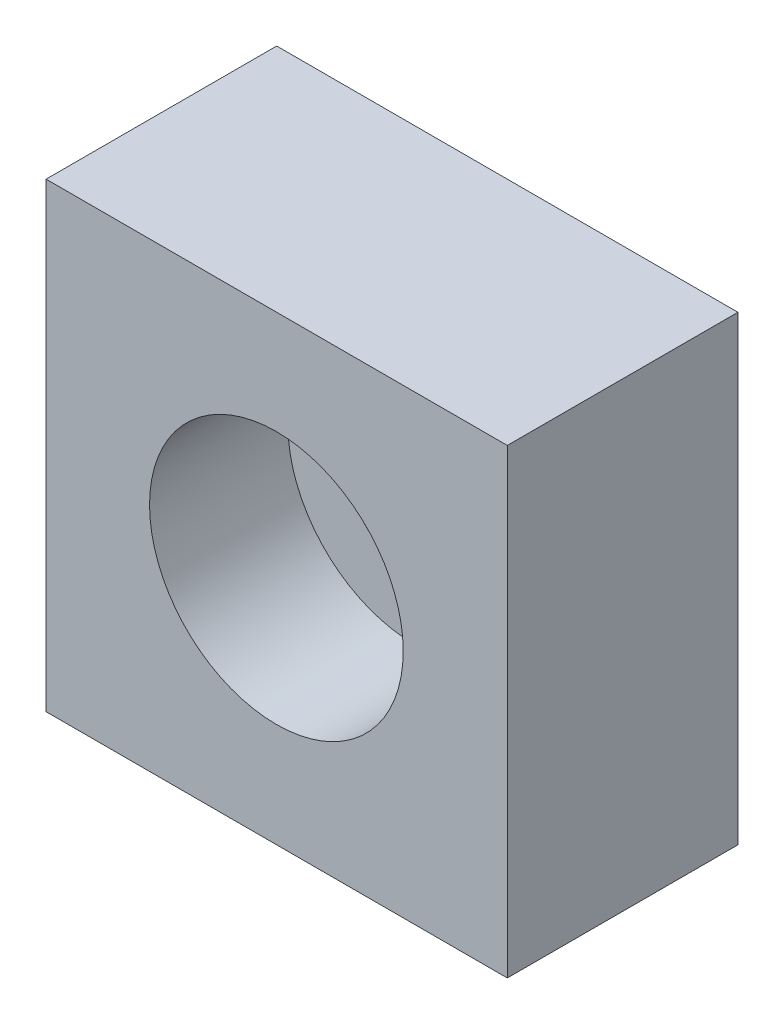
ISO-10303-21;
HEADER;
FILE_DESCRIPTION(('STEP AP214'),'2;1');
FILE_NAME('part.step','',(''),(''),'','','');
FILE_SCHEMA(('AUTOMOTIVE_DESIGN { 1 0 10303 214 1 1 1 1 }'));
ENDSEC;
DATA;
#1=APPLICATION_CONTEXT('core data for automotive mechanical design processes');
#2=APPLICATION_PROTOCOL_DEFINITION('international standard','automotive_design',2000,#1);
#3=PRODUCT_CONTEXT('',#1,'mechanical');
#4=PRODUCT('Part','Part','',(#3));
#5=PRODUCT_RELATED_PRODUCT_CATEGORY('part','',(#4));
#6=PRODUCT_DEFINITION_FORMATION('','',#4);
#7=PRODUCT_DEFINITION_CONTEXT('part definition',#1,'design');
#8=PRODUCT_DEFINITION('design','',#6,#7);
#9=PRODUCT_DEFINITION_SHAPE('','',#8);
#10=(LENGTH_UNIT() NAMED_UNIT(*) SI_UNIT(.MILLI.,.METRE.));
#11=(NAMED_UNIT(*) PLANE_ANGLE_UNIT() SI_UNIT($,.RADIAN.));
#12=(NAMED_UNIT(*) SI_UNIT($,.STERADIAN.) SOLID_ANGLE_UNIT());
#13=UNCERTAINTY_MEASURE_WITH_UNIT(LENGTH_MEASURE(1.E-05),#10,'distance_accuracy_value','');
#14=(GEOMETRIC_REPRESENTATION_CONTEXT(3) GLOBAL_UNCERTAINTY_ASSIGNED_CONTEXT((#13)) GLOBAL_UNIT_ASSIGNED_CONTEXT((#10,
#11,#12)) REPRESENTATION_CONTEXT('',''));
#15=CARTESIAN_POINT('',(0.,0.,0.));
#16=DIRECTION('',(0.,0.,1.));
#17=DIRECTION('',(1.,0.,0.));
#18=AXIS2_PLACEMENT_3D('',#15,#16,#17);
#19=CARTESIAN_POINT('',(0.,0.,10.));
#20=DIRECTION('',(1.,0.,0.));
#21=DIRECTION('',(0.,0.,-1.));
#22=AXIS2_PLACEMENT_3D('',#19,#20,#21);
#23=PLANE('',#22);
#24=DIRECTION('',(0.,-1.,0.));
#25=VECTOR('',#24,1.);
#26=CARTESIAN_POINT('',(0.,0.,0.));
#27=LINE('',#26,#25);
#28=CARTESIAN_POINT('',(0.,20.,0.));
#29=VERTEX_POINT('',#28);
#30=CARTESIAN_POINT('',(0.,0.,0.));
#31=VERTEX_POINT('',#30);
#32=EDGE_CURVE('E105',#29,#31,#27,.T.);
#33=ORIENTED_EDGE('',*,*,#32,.T.);
#34=DIRECTION('',(0.,0.,-1.));
#35=VECTOR('',#34,1.);
#36=CARTESIAN_POINT('',(0.,0.,10.));
#37=LINE('',#36,#35);
#38=CARTESIAN_POINT('',(0.,0.,10.));
#39=VERTEX_POINT('',#38);
#40=EDGE_CURVE('E11',#39,#31,#37,.T.);
#41=ORIENTED_EDGE('',*,*,#40,.F.);
#42=DIRECTION('',(0.,-1.,0.));
#43=VECTOR('',#42,1.);
#44=CARTESIAN_POINT('',(0.,0.,10.));
#45=LINE('',#44,#43);
#46=CARTESIAN_POINT('',(0.,20.,10.));
#47=VERTEX_POINT('',#46);
#48=EDGE_CURVE('E89',#47,#39,#45,.T.);
#49=ORIENTED_EDGE('',*,*,#48,.F.);
#50=DIRECTION('',(0.,0.,-1.));
#51=VECTOR('',#50,1.);
#52=CARTESIAN_POINT('',(0.,20.,10.));
#53=LINE('',#52,#51);
#54=EDGE_CURVE('E98',#47,#29,#53,.T.);
#55=ORIENTED_EDGE('',*,*,#54,.T.);
#56=EDGE_LOOP('',(#33,#41,#49,#55));
#57=FACE_BOUND('',#56,.T.);
#58=ADVANCED_FACE('F39',(#57),#23,.F.);
#59=CARTESIAN_POINT('',(0.,0.,10.));
#60=DIRECTION('',(0.,1.,0.));
#61=DIRECTION('',(0.,0.,1.));
#62=AXIS2_PLACEMENT_3D('',#59,#60,#61);
#63=PLANE('',#62);
#64=DIRECTION('',(1.,0.,0.));
#65=VECTOR('',#64,1.);
#66=CARTESIAN_POINT('',(0.,0.,0.));
#67=LINE('',#66,#65);
#68=CARTESIAN_POINT('',(20.,0.,0.));
#69=VERTEX_POINT('',#68);
#70=EDGE_CURVE('E94',#31,#69,#67,.T.);
#71=ORIENTED_EDGE('',*,*,#70,.T.);
#72=DIRECTION('',(0.,0.,-1.));
#73=VECTOR('',#72,1.);
#74=CARTESIAN_POINT('',(20.,0.,10.));
#75=LINE('',#74,#73);
#76=CARTESIAN_POINT('',(20.,0.,10.));
#77=VERTEX_POINT('',#76);
#78=EDGE_CURVE('E50',#77,#69,#75,.T.);
#79=ORIENTED_EDGE('',*,*,#78,.F.);
#80=DIRECTION('',(1.,0.,0.));
#81=VECTOR('',#80,1.);
#82=CARTESIAN_POINT('',(0.,0.,10.));
#83=LINE('',#82,#81);
#84=EDGE_CURVE('E84',#39,#77,#83,.T.);
#85=ORIENTED_EDGE('',*,*,#84,.F.);
#86=ORIENTED_EDGE('',*,*,#40,.T.);
#87=EDGE_LOOP('',(#71,#79,#85,#86));
#88=FACE_BOUND('',#87,.T.);
#89=ADVANCED_FACE('F91',(#88),#63,.F.);
#90=CARTESIAN_POINT('',(20.,0.,10.));
#91=DIRECTION('',(-1.,0.,0.));
#92=DIRECTION('',(0.,0.,1.));
#93=AXIS2_PLACEMENT_3D('',#90,#91,#92);
#94=PLANE('',#93);
#95=DIRECTION('',(0.,1.,0.));
#96=VECTOR('',#95,1.);
#97=CARTESIAN_POINT('',(20.,0.,0.));
#98=LINE('',#97,#96);
#99=CARTESIAN_POINT('',(20.,20.,0.));
#100=VERTEX_POINT('',#99);
#101=EDGE_CURVE('E75',#69,#100,#98,.T.);
#102=ORIENTED_EDGE('',*,*,#101,.T.);
#103=DIRECTION('',(0.,0.,-1.));
#104=VECTOR('',#103,1.);
#105=CARTESIAN_POINT('',(20.,20.,10.));
#106=LINE('',#105,#104);
#107=CARTESIAN_POINT('',(20.,20.,10.));
#108=VERTEX_POINT('',#107);
#109=EDGE_CURVE('E92',#108,#100,#106,.T.);
#110=ORIENTED_EDGE('',*,*,#109,.F.);
#111=DIRECTION('',(0.,1.,0.));
#112=VECTOR('',#111,1.);
#113=CARTESIAN_POINT('',(20.,0.,10.));
#114=LINE('',#113,#112);
#115=EDGE_CURVE('E86',#77,#108,#114,.T.);
#116=ORIENTED_EDGE('',*,*,#115,.F.);
#117=ORIENTED_EDGE('',*,*,#78,.T.);
#118=EDGE_LOOP('',(#102,#110,#116,#117));
#119=FACE_BOUND('',#118,.T.);
#120=ADVANCED_FACE('F96',(#119),#94,.F.);
#121=CARTESIAN_POINT('',(0.,20.,10.));
#122=DIRECTION('',(0.,-1.,0.));
#123=DIRECTION('',(0.,0.,-1.));
#124=AXIS2_PLACEMENT_3D('',#121,#122,#123);
#125=PLANE('',#124);
#126=DIRECTION('',(-1.,0.,0.));
#127=VECTOR('',#126,1.);
#128=CARTESIAN_POINT('',(0.,20.,0.));
#129=LINE('',#128,#127);
#130=EDGE_CURVE('E79',#100,#29,#129,.T.);
#131=ORIENTED_EDGE('',*,*,#130,.T.);
#132=ORIENTED_EDGE('',*,*,#54,.F.);
#133=DIRECTION('',(-1.,0.,0.));
#134=VECTOR('',#133,1.);
#135=CARTESIAN_POINT('',(0.,20.,10.));
#136=LINE('',#135,#134);
#137=EDGE_CURVE('E54',#108,#47,#136,.T.);
#138=ORIENTED_EDGE('',*,*,#137,.F.);
#139=ORIENTED_EDGE('',*,*,#109,.T.);
#140=EDGE_LOOP('',(#131,#132,#138,#139));
#141=FACE_BOUND('',#140,.T.);
#142=ADVANCED_FACE('F109',(#141),#125,.F.);
#143=CARTESIAN_POINT('',(0.,0.,10.));
#144=DIRECTION('',(0.,0.,-1.));
#145=DIRECTION('',(-1.,0.,0.));
#146=AXIS2_PLACEMENT_3D('',#143,#144,#145);
#147=PLANE('',#146);
#148=CARTESIAN_POINT('',(9.98648737498797,10.0143055988724,10.));
#149=DIRECTION('',(0.,0.,1.));
#150=DIRECTION('',(1.,0.,0.));
#151=AXIS2_PLACEMENT_3D('',#148,#149,#150);
#152=CIRCLE('',#151,5.49999999999999);
#153=CARTESIAN_POINT('',(15.486487374988,10.0143055988724,10.));
#154=VERTEX_POINT('',#153);
#155=EDGE_CURVE('E123',#154,#154,#152,.T.);
#156=ORIENTED_EDGE('',*,*,#155,.F.);
#157=EDGE_LOOP('',(#156));
#158=FACE_BOUND('',#157,.T.);
#159=ORIENTED_EDGE('',*,*,#48,.T.);
#160=ORIENTED_EDGE('',*,*,#84,.T.);
#161=ORIENTED_EDGE('',*,*,#115,.T.);
#162=ORIENTED_EDGE('',*,*,#137,.T.);
#163=EDGE_LOOP('',(#159,#160,#161,#162));
#164=FACE_BOUND('',#163,.T.);
#165=ADVANCED_FACE('F88',(#158,#164),#147,.F.);
#166=CARTESIAN_POINT('',(0.,0.,0.));
#167=DIRECTION('',(0.,0.,-1.));
#168=DIRECTION('',(-1.,0.,0.));
#169=AXIS2_PLACEMENT_3D('',#166,#167,#168);
#170=PLANE('',#169);
#171=ORIENTED_EDGE('',*,*,#32,.F.);
#172=ORIENTED_EDGE('',*,*,#130,.F.);
#173=ORIENTED_EDGE('',*,*,#101,.F.);
#174=ORIENTED_EDGE('',*,*,#70,.F.);
#175=EDGE_LOOP('',(#171,#172,#173,#174));
#176=FACE_BOUND('',#175,.T.);
#177=ADVANCED_FACE('F114',(#176),#170,.T.);
#178=CARTESIAN_POINT('',(9.98648737498797,10.0143055988724,2.));
#179=DIRECTION('',(0.,0.,-1.));
#180=DIRECTION('',(-1.,0.,0.));
#181=AXIS2_PLACEMENT_3D('',#178,#179,#180);
#182=PLANE('',#181);
#183=CARTESIAN_POINT('',(9.98648737498797,10.0143055988724,2.));
#184=DIRECTION('',(0.,0.,1.));
#185=DIRECTION('',(1.,0.,0.));
#186=AXIS2_PLACEMENT_3D('',#183,#184,#185);
#187=CIRCLE('',#186,3.);
#188=CARTESIAN_POINT('',(12.986487374988,10.0143055988724,2.));
#189=VERTEX_POINT('',#188);
#190=EDGE_CURVE('E104',#189,#189,#187,.T.);
#191=ORIENTED_EDGE('',*,*,#190,.T.);
#192=EDGE_LOOP('',(#191));
#193=FACE_BOUND('',#192,.T.);
#194=ADVANCED_FACE('F136',(#193),#182,.F.);
#195=CARTESIAN_POINT('',(9.98648737498797,10.0143055988724,10.));
#196=DIRECTION('',(0.,0.,1.));
#197=DIRECTION('',(1.,0.,0.));
#198=AXIS2_PLACEMENT_3D('',#195,#196,#197);
#199=CYLINDRICAL_SURFACE('',#198,3.);
#200=ORIENTED_EDGE('',*,*,#190,.F.);
#201=EDGE_LOOP('',(#200));
#202=FACE_BOUND('',#201,.T.);
#203=CARTESIAN_POINT('',(9.98648737498797,10.0143055988724,4.));
#204=DIRECTION('',(0.,0.,1.));
#205=DIRECTION('',(1.,0.,0.));
#206=AXIS2_PLACEMENT_3D('',#203,#204,#205);
#207=CIRCLE('',#206,3.00000000000001);
#208=CARTESIAN_POINT('',(12.986487374988,10.0143055988724,4.));
#209=VERTEX_POINT('',#208);
#210=EDGE_CURVE('E119',#209,#209,#207,.T.);
#211=ORIENTED_EDGE('',*,*,#210,.T.);
#212=EDGE_LOOP('',(#211));
#213=FACE_BOUND('',#212,.T.);
#214=ADVANCED_FACE('F174',(#202,#213),#199,.F.);
#215=CARTESIAN_POINT('',(12.986487374988,10.0143055988724,4.));
#216=DIRECTION('',(0.,0.,-1.));
#217=DIRECTION('',(-1.,0.,0.));
#218=AXIS2_PLACEMENT_3D('',#215,#216,#217);
#219=PLANE('',#218);
#220=ORIENTED_EDGE('',*,*,#210,.F.);
#221=EDGE_LOOP('',(#220));
#222=FACE_BOUND('',#221,.T.);
#223=CARTESIAN_POINT('',(9.98648737498797,10.0143055988724,4.));
#224=DIRECTION('',(0.,0.,1.));
#225=DIRECTION('',(1.,0.,0.));
#226=AXIS2_PLACEMENT_3D('',#223,#224,#225);
#227=CIRCLE('',#226,5.49999999999999);
#228=CARTESIAN_POINT('',(15.486487374988,10.0143055988724,4.));
#229=VERTEX_POINT('',#228);
#230=EDGE_CURVE('E121',#229,#229,#227,.T.);
#231=ORIENTED_EDGE('',*,*,#230,.T.);
#232=EDGE_LOOP('',(#231));
#233=FACE_BOUND('',#232,.T.);
#234=ADVANCED_FACE('F185',(#222,#233),#219,.F.);
#235=CARTESIAN_POINT('',(9.98648737498797,10.0143055988724,10.));
#236=DIRECTION('',(0.,0.,1.));
#237=DIRECTION('',(1.,0.,0.));
#238=AXIS2_PLACEMENT_3D('',#235,#236,#237);
#239=CYLINDRICAL_SURFACE('',#238,5.49999999999999);
#240=ORIENTED_EDGE('',*,*,#230,.F.);
#241=EDGE_LOOP('',(#240));
#242=FACE_BOUND('',#241,.T.);
#243=ORIENTED_EDGE('',*,*,#155,.T.);
#244=EDGE_LOOP('',(#243));
#245=FACE_BOUND('',#244,.T.);
#246=ADVANCED_FACE('F126',(#242,#245),#239,.F.);
#247=CLOSED_SHELL('',(#58,#89,#120,#142,#165,#177,#194,#214,#234,#246));
#248=MANIFOLD_SOLID_BREP('B2',#247);
#249=ADVANCED_BREP_SHAPE_REPRESENTATION('',(#18,#248),#14);
#250=SHAPE_DEFINITION_REPRESENTATION(#9,#249);
ENDSEC;
END-ISO-10303-21;
